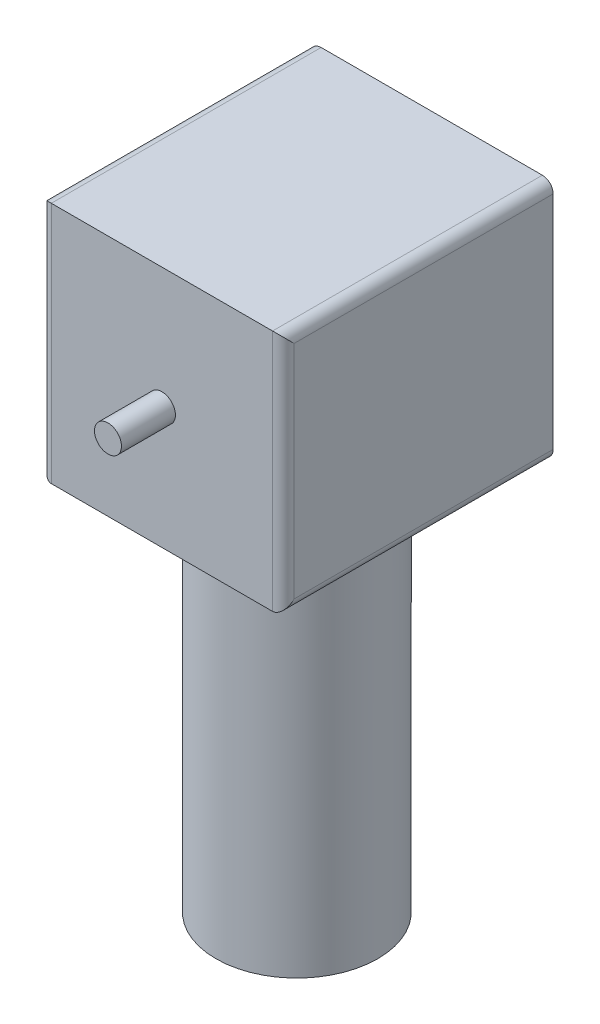
ISO-10303-21;
HEADER;
FILE_DESCRIPTION(('STEP AP214'),'2;1');
FILE_NAME('part.step','',(''),(''),'','','');
FILE_SCHEMA(('AUTOMOTIVE_DESIGN { 1 0 10303 214 1 1 1 1 }'));
ENDSEC;
DATA;
#1=APPLICATION_CONTEXT('core data for automotive mechanical design processes');
#2=APPLICATION_PROTOCOL_DEFINITION('international standard','automotive_design',2000,#1);
#3=PRODUCT_CONTEXT('',#1,'mechanical');
#4=PRODUCT('Part','Part','',(#3));
#5=PRODUCT_RELATED_PRODUCT_CATEGORY('part','',(#4));
#6=PRODUCT_DEFINITION_FORMATION('','',#4);
#7=PRODUCT_DEFINITION_CONTEXT('part definition',#1,'design');
#8=PRODUCT_DEFINITION('design','',#6,#7);
#9=PRODUCT_DEFINITION_SHAPE('','',#8);
#10=(LENGTH_UNIT() NAMED_UNIT(*) SI_UNIT(.MILLI.,.METRE.));
#11=(NAMED_UNIT(*) PLANE_ANGLE_UNIT() SI_UNIT($,.RADIAN.));
#12=(NAMED_UNIT(*) SI_UNIT($,.STERADIAN.) SOLID_ANGLE_UNIT());
#13=UNCERTAINTY_MEASURE_WITH_UNIT(LENGTH_MEASURE(1.E-05),#10,'distance_accuracy_value','');
#14=(GEOMETRIC_REPRESENTATION_CONTEXT(3) GLOBAL_UNCERTAINTY_ASSIGNED_CONTEXT((#13)) GLOBAL_UNIT_ASSIGNED_CONTEXT((#10,
#11,#12)) REPRESENTATION_CONTEXT('',''));
#15=CARTESIAN_POINT('',(0.,0.,0.));
#16=DIRECTION('',(0.,0.,1.));
#17=DIRECTION('',(1.,0.,0.));
#18=AXIS2_PLACEMENT_3D('',#15,#16,#17);
#19=CARTESIAN_POINT('',(22.5,22.5,50.));
#20=DIRECTION('',(-1.,0.,0.));
#21=DIRECTION('',(0.,-1.,0.));
#22=AXIS2_PLACEMENT_3D('',#19,#20,#21);
#23=PLANE('',#22);
#24=DIRECTION('',(0.,1.,0.));
#25=VECTOR('',#24,1.);
#26=CARTESIAN_POINT('',(22.5,-22.5,48.));
#27=LINE('',#26,#25);
#28=CARTESIAN_POINT('',(22.5,20.5,48.));
#29=VERTEX_POINT('',#28);
#30=CARTESIAN_POINT('',(22.5,-20.5,48.));
#31=VERTEX_POINT('',#30);
#32=EDGE_CURVE('E105',#29,#31,#27,.F.);
#33=ORIENTED_EDGE('',*,*,#32,.T.);
#34=DIRECTION('',(0.,0.,-1.));
#35=VECTOR('',#34,1.);
#36=CARTESIAN_POINT('',(22.5,-20.5,50.));
#37=LINE('',#36,#35);
#38=CARTESIAN_POINT('',(22.5,-20.5,0.));
#39=VERTEX_POINT('',#38);
#40=EDGE_CURVE('E158',#31,#39,#37,.T.);
#41=ORIENTED_EDGE('',*,*,#40,.T.);
#42=DIRECTION('',(0.,1.,0.));
#43=VECTOR('',#42,1.);
#44=CARTESIAN_POINT('',(22.5,22.5,0.));
#45=LINE('',#44,#43);
#46=CARTESIAN_POINT('',(22.5,20.5,0.));
#47=VERTEX_POINT('',#46);
#48=EDGE_CURVE('E141',#39,#47,#45,.T.);
#49=ORIENTED_EDGE('',*,*,#48,.T.);
#50=DIRECTION('',(0.,0.,-1.));
#51=VECTOR('',#50,1.);
#52=CARTESIAN_POINT('',(22.5,20.5,50.));
#53=LINE('',#52,#51);
#54=EDGE_CURVE('E155',#47,#29,#53,.F.);
#55=ORIENTED_EDGE('',*,*,#54,.T.);
#56=EDGE_LOOP('',(#33,#41,#49,#55));
#57=FACE_BOUND('',#56,.T.);
#58=ADVANCED_FACE('F32',(#57),#23,.F.);
#59=CARTESIAN_POINT('',(-22.5,22.5,50.));
#60=DIRECTION('',(0.,-1.,0.));
#61=DIRECTION('',(0.,0.,-1.));
#62=AXIS2_PLACEMENT_3D('',#59,#60,#61);
#63=PLANE('',#62);
#64=DIRECTION('',(-1.,0.,0.));
#65=VECTOR('',#64,1.);
#66=CARTESIAN_POINT('',(-22.5,22.5,0.));
#67=LINE('',#66,#65);
#68=CARTESIAN_POINT('',(20.5,22.5,0.));
#69=VERTEX_POINT('',#68);
#70=CARTESIAN_POINT('',(-20.5,22.5,0.));
#71=VERTEX_POINT('',#70);
#72=EDGE_CURVE('E144',#69,#71,#67,.T.);
#73=ORIENTED_EDGE('',*,*,#72,.T.);
#74=DIRECTION('',(0.,0.,-1.));
#75=VECTOR('',#74,1.);
#76=CARTESIAN_POINT('',(-20.5,22.5,50.));
#77=LINE('',#76,#75);
#78=CARTESIAN_POINT('',(-20.5,22.5,50.));
#79=VERTEX_POINT('',#78);
#80=EDGE_CURVE('E114',#71,#79,#77,.F.);
#81=ORIENTED_EDGE('',*,*,#80,.T.);
#82=DIRECTION('',(-1.,0.,0.));
#83=VECTOR('',#82,1.);
#84=CARTESIAN_POINT('',(-22.5,22.5,50.));
#85=LINE('',#84,#83);
#86=CARTESIAN_POINT('',(20.5,22.5,50.));
#87=VERTEX_POINT('',#86);
#88=EDGE_CURVE('E122',#87,#79,#85,.T.);
#89=ORIENTED_EDGE('',*,*,#88,.F.);
#90=DIRECTION('',(0.,0.,-1.));
#91=VECTOR('',#90,1.);
#92=CARTESIAN_POINT('',(20.5,22.5,50.));
#93=LINE('',#92,#91);
#94=EDGE_CURVE('E54',#87,#69,#93,.T.);
#95=ORIENTED_EDGE('',*,*,#94,.T.);
#96=EDGE_LOOP('',(#73,#81,#89,#95));
#97=FACE_BOUND('',#96,.T.);
#98=ADVANCED_FACE('F129',(#97),#63,.F.);
#99=CARTESIAN_POINT('',(-22.5,22.5,50.));
#100=DIRECTION('',(1.,0.,0.));
#101=DIRECTION('',(0.,1.,0.));
#102=AXIS2_PLACEMENT_3D('',#99,#100,#101);
#103=PLANE('',#102);
#104=DIRECTION('',(0.,-1.,0.));
#105=VECTOR('',#104,1.);
#106=CARTESIAN_POINT('',(-22.5,22.5,0.));
#107=LINE('',#106,#105);
#108=CARTESIAN_POINT('',(-22.5,20.5,0.));
#109=VERTEX_POINT('',#108);
#110=CARTESIAN_POINT('',(-22.5,-20.5,0.));
#111=VERTEX_POINT('',#110);
#112=EDGE_CURVE('E135',#109,#111,#107,.T.);
#113=ORIENTED_EDGE('',*,*,#112,.T.);
#114=DIRECTION('',(0.,0.,-1.));
#115=VECTOR('',#114,1.);
#116=CARTESIAN_POINT('',(-22.5,-20.5,50.));
#117=LINE('',#116,#115);
#118=CARTESIAN_POINT('',(-22.5,-20.5,48.));
#119=VERTEX_POINT('',#118);
#120=EDGE_CURVE('E153',#111,#119,#117,.F.);
#121=ORIENTED_EDGE('',*,*,#120,.T.);
#122=DIRECTION('',(0.,-1.,0.));
#123=VECTOR('',#122,1.);
#124=CARTESIAN_POINT('',(-22.5,22.5,48.));
#125=LINE('',#124,#123);
#126=CARTESIAN_POINT('',(-22.5,20.5,48.));
#127=VERTEX_POINT('',#126);
#128=EDGE_CURVE('E151',#119,#127,#125,.F.);
#129=ORIENTED_EDGE('',*,*,#128,.T.);
#130=DIRECTION('',(0.,0.,-1.));
#131=VECTOR('',#130,1.);
#132=CARTESIAN_POINT('',(-22.5,20.5,50.));
#133=LINE('',#132,#131);
#134=EDGE_CURVE('E149',#127,#109,#133,.T.);
#135=ORIENTED_EDGE('',*,*,#134,.T.);
#136=EDGE_LOOP('',(#113,#121,#129,#135));
#137=FACE_BOUND('',#136,.T.);
#138=ADVANCED_FACE('F214',(#137),#103,.F.);
#139=CARTESIAN_POINT('',(-22.5,-22.5,50.));
#140=DIRECTION('',(0.,1.,0.));
#141=DIRECTION('',(0.,0.,1.));
#142=AXIS2_PLACEMENT_3D('',#139,#140,#141);
#143=PLANE('',#142);
#144=CARTESIAN_POINT('',(0.,-22.5,25.));
#145=DIRECTION('',(0.,1.,0.));
#146=DIRECTION('',(0.,0.,1.));
#147=AXIS2_PLACEMENT_3D('',#144,#145,#146);
#148=CIRCLE('',#147,20.);
#149=CARTESIAN_POINT('',(0.,-22.5,45.));
#150=VERTEX_POINT('',#149);
#151=EDGE_CURVE('E40',#150,#150,#148,.T.);
#152=ORIENTED_EDGE('',*,*,#151,.T.);
#153=EDGE_LOOP('',(#152));
#154=FACE_BOUND('',#153,.T.);
#155=DIRECTION('',(1.,0.,0.));
#156=VECTOR('',#155,1.);
#157=CARTESIAN_POINT('',(-22.5,-22.5,0.));
#158=LINE('',#157,#156);
#159=CARTESIAN_POINT('',(-20.5,-22.5,0.));
#160=VERTEX_POINT('',#159);
#161=CARTESIAN_POINT('',(20.5,-22.5,0.));
#162=VERTEX_POINT('',#161);
#163=EDGE_CURVE('E131',#160,#162,#158,.T.);
#164=ORIENTED_EDGE('',*,*,#163,.T.);
#165=DIRECTION('',(0.,0.,-1.));
#166=VECTOR('',#165,1.);
#167=CARTESIAN_POINT('',(20.5,-22.5,50.));
#168=LINE('',#167,#166);
#169=CARTESIAN_POINT('',(20.5,-22.5,50.));
#170=VERTEX_POINT('',#169);
#171=EDGE_CURVE('E115',#162,#170,#168,.F.);
#172=ORIENTED_EDGE('',*,*,#171,.T.);
#173=DIRECTION('',(1.,0.,0.));
#174=VECTOR('',#173,1.);
#175=CARTESIAN_POINT('',(-22.5,-22.5,50.));
#176=LINE('',#175,#174);
#177=CARTESIAN_POINT('',(-20.5,-22.5,50.));
#178=VERTEX_POINT('',#177);
#179=EDGE_CURVE('E125',#178,#170,#176,.T.);
#180=ORIENTED_EDGE('',*,*,#179,.F.);
#181=DIRECTION('',(0.,0.,-1.));
#182=VECTOR('',#181,1.);
#183=CARTESIAN_POINT('',(-20.5,-22.5,50.));
#184=LINE('',#183,#182);
#185=EDGE_CURVE('E166',#178,#160,#184,.T.);
#186=ORIENTED_EDGE('',*,*,#185,.T.);
#187=EDGE_LOOP('',(#164,#172,#180,#186));
#188=FACE_BOUND('',#187,.T.);
#189=ADVANCED_FACE('F181',(#154,#188),#143,.F.);
#190=CARTESIAN_POINT('',(0.,0.,50.));
#191=DIRECTION('',(0.,0.,1.));
#192=DIRECTION('',(1.,0.,0.));
#193=AXIS2_PLACEMENT_3D('',#190,#191,#192);
#194=PLANE('',#193);
#195=CARTESIAN_POINT('',(0.,0.,50.));
#196=DIRECTION('',(0.,0.,1.));
#197=DIRECTION('',(1.,0.,0.));
#198=AXIS2_PLACEMENT_3D('',#195,#196,#197);
#199=CIRCLE('',#198,2.5);
#200=CARTESIAN_POINT('',(2.5,0.,50.));
#201=VERTEX_POINT('',#200);
#202=EDGE_CURVE('E263',#201,#201,#199,.T.);
#203=ORIENTED_EDGE('',*,*,#202,.F.);
#204=EDGE_LOOP('',(#203));
#205=FACE_BOUND('',#204,.T.);
#206=ORIENTED_EDGE('',*,*,#88,.T.);
#207=DIRECTION('',(0.,-1.,0.));
#208=VECTOR('',#207,1.);
#209=CARTESIAN_POINT('',(-20.5,-22.5,50.));
#210=LINE('',#209,#208);
#211=EDGE_CURVE('E127',#79,#178,#210,.T.);
#212=ORIENTED_EDGE('',*,*,#211,.T.);
#213=ORIENTED_EDGE('',*,*,#179,.T.);
#214=DIRECTION('',(0.,1.,0.));
#215=VECTOR('',#214,1.);
#216=CARTESIAN_POINT('',(20.5,22.5,50.));
#217=LINE('',#216,#215);
#218=EDGE_CURVE('E104',#170,#87,#217,.T.);
#219=ORIENTED_EDGE('',*,*,#218,.T.);
#220=EDGE_LOOP('',(#206,#212,#213,#219));
#221=FACE_BOUND('',#220,.T.);
#222=ADVANCED_FACE('F120',(#205,#221),#194,.T.);
#223=CARTESIAN_POINT('',(0.,0.,0.));
#224=DIRECTION('',(0.,0.,1.));
#225=DIRECTION('',(1.,0.,0.));
#226=AXIS2_PLACEMENT_3D('',#223,#224,#225);
#227=PLANE('',#226);
#228=CARTESIAN_POINT('',(0.,0.,0.));
#229=DIRECTION('',(0.,0.,1.));
#230=DIRECTION('',(1.,0.,0.));
#231=AXIS2_PLACEMENT_3D('',#228,#229,#230);
#232=CIRCLE('',#231,2.5);
#233=CARTESIAN_POINT('',(2.5,0.,0.));
#234=VERTEX_POINT('',#233);
#235=EDGE_CURVE('E11',#234,#234,#232,.F.);
#236=ORIENTED_EDGE('',*,*,#235,.F.);
#237=EDGE_LOOP('',(#236));
#238=FACE_BOUND('',#237,.T.);
#239=ORIENTED_EDGE('',*,*,#48,.F.);
#240=CARTESIAN_POINT('',(20.5,-20.5,0.));
#241=DIRECTION('',(0.,0.,1.));
#242=DIRECTION('',(1.,0.,0.));
#243=AXIS2_PLACEMENT_3D('',#240,#241,#242);
#244=CIRCLE('',#243,2.);
#245=EDGE_CURVE('E164',#39,#162,#244,.F.);
#246=ORIENTED_EDGE('',*,*,#245,.T.);
#247=ORIENTED_EDGE('',*,*,#163,.F.);
#248=CARTESIAN_POINT('',(-20.5,-20.5,0.));
#249=DIRECTION('',(0.,0.,1.));
#250=DIRECTION('',(1.,0.,0.));
#251=AXIS2_PLACEMENT_3D('',#248,#249,#250);
#252=CIRCLE('',#251,2.);
#253=EDGE_CURVE('E162',#160,#111,#252,.F.);
#254=ORIENTED_EDGE('',*,*,#253,.T.);
#255=ORIENTED_EDGE('',*,*,#112,.F.);
#256=CARTESIAN_POINT('',(-20.5,20.5,0.));
#257=DIRECTION('',(0.,0.,1.));
#258=DIRECTION('',(1.,0.,0.));
#259=AXIS2_PLACEMENT_3D('',#256,#257,#258);
#260=CIRCLE('',#259,2.);
#261=EDGE_CURVE('E47',#109,#71,#260,.F.);
#262=ORIENTED_EDGE('',*,*,#261,.T.);
#263=ORIENTED_EDGE('',*,*,#72,.F.);
#264=CARTESIAN_POINT('',(20.5,20.5,0.));
#265=DIRECTION('',(0.,0.,1.));
#266=DIRECTION('',(1.,0.,0.));
#267=AXIS2_PLACEMENT_3D('',#264,#265,#266);
#268=CIRCLE('',#267,2.);
#269=EDGE_CURVE('E113',#69,#47,#268,.F.);
#270=ORIENTED_EDGE('',*,*,#269,.T.);
#271=EDGE_LOOP('',(#239,#246,#247,#254,#255,#262,#263,#270));
#272=FACE_BOUND('',#271,.T.);
#273=ADVANCED_FACE('F193',(#238,#272),#227,.F.);
#274=CARTESIAN_POINT('',(0.,-93.5,25.));
#275=DIRECTION('',(0.,1.,0.));
#276=DIRECTION('',(0.,0.,1.));
#277=AXIS2_PLACEMENT_3D('',#274,#275,#276);
#278=CYLINDRICAL_SURFACE('',#277,15.);
#279=CARTESIAN_POINT('',(0.,-27.5,25.));
#280=DIRECTION('',(0.,1.,0.));
#281=DIRECTION('',(0.,0.,1.));
#282=AXIS2_PLACEMENT_3D('',#279,#280,#281);
#283=CIRCLE('',#282,15.);
#284=CARTESIAN_POINT('',(0.,-27.5,40.));
#285=VERTEX_POINT('',#284);
#286=EDGE_CURVE('E170',#285,#285,#283,.F.);
#287=ORIENTED_EDGE('',*,*,#286,.T.);
#288=EDGE_LOOP('',(#287));
#289=FACE_BOUND('',#288,.T.);
#290=CARTESIAN_POINT('',(0.,-93.5,25.));
#291=DIRECTION('',(0.,-1.,0.));
#292=DIRECTION('',(0.,0.,-1.));
#293=AXIS2_PLACEMENT_3D('',#290,#291,#292);
#294=CIRCLE('',#293,15.);
#295=CARTESIAN_POINT('',(0.,-93.5,10.));
#296=VERTEX_POINT('',#295);
#297=EDGE_CURVE('E138',#296,#296,#294,.T.);
#298=ORIENTED_EDGE('',*,*,#297,.F.);
#299=EDGE_LOOP('',(#298));
#300=FACE_BOUND('',#299,.T.);
#301=ADVANCED_FACE('F189',(#289,#300),#278,.T.);
#302=CARTESIAN_POINT('',(0.,-93.5,25.));
#303=DIRECTION('',(0.,-1.,0.));
#304=DIRECTION('',(0.,0.,-1.));
#305=AXIS2_PLACEMENT_3D('',#302,#303,#304);
#306=PLANE('',#305);
#307=ORIENTED_EDGE('',*,*,#297,.T.);
#308=EDGE_LOOP('',(#307));
#309=FACE_BOUND('',#308,.T.);
#310=ADVANCED_FACE('F192',(#309),#306,.T.);
#311=CARTESIAN_POINT('',(-20.5,20.5,50.));
#312=DIRECTION('',(0.,0.,-1.));
#313=DIRECTION('',(-1.,0.,0.));
#314=AXIS2_PLACEMENT_3D('',#311,#312,#313);
#315=CYLINDRICAL_SURFACE('',#314,2.);
#316=ORIENTED_EDGE('',*,*,#261,.F.);
#317=ORIENTED_EDGE('',*,*,#134,.F.);
#318=CARTESIAN_POINT('',(-20.5,20.5,48.));
#319=DIRECTION('',(0.,0.707106781186547,-0.707106781186547));
#320=DIRECTION('',(0.,-0.707106781186547,-0.707106781186547));
#321=AXIS2_PLACEMENT_3D('',#318,#319,#320);
#322=ELLIPSE('',#321,2.82842712474619,2.);
#323=EDGE_CURVE('E173',#79,#127,#322,.F.);
#324=ORIENTED_EDGE('',*,*,#323,.F.);
#325=ORIENTED_EDGE('',*,*,#80,.F.);
#326=EDGE_LOOP('',(#316,#317,#324,#325));
#327=FACE_BOUND('',#326,.T.);
#328=ADVANCED_FACE('F199',(#327),#315,.T.);
#329=CARTESIAN_POINT('',(-20.5,-20.5,50.));
#330=DIRECTION('',(0.,0.,-1.));
#331=DIRECTION('',(-1.,0.,0.));
#332=AXIS2_PLACEMENT_3D('',#329,#330,#331);
#333=CYLINDRICAL_SURFACE('',#332,2.);
#334=ORIENTED_EDGE('',*,*,#253,.F.);
#335=ORIENTED_EDGE('',*,*,#185,.F.);
#336=CARTESIAN_POINT('',(-20.5,-20.5,48.));
#337=DIRECTION('',(0.,-0.707106781186547,-0.707106781186547));
#338=DIRECTION('',(0.,0.707106781186547,-0.707106781186547));
#339=AXIS2_PLACEMENT_3D('',#336,#337,#338);
#340=ELLIPSE('',#339,2.82842712474619,2.);
#341=EDGE_CURVE('E171',#119,#178,#340,.F.);
#342=ORIENTED_EDGE('',*,*,#341,.F.);
#343=ORIENTED_EDGE('',*,*,#120,.F.);
#344=EDGE_LOOP('',(#334,#335,#342,#343));
#345=FACE_BOUND('',#344,.T.);
#346=ADVANCED_FACE('F204',(#345),#333,.T.);
#347=CARTESIAN_POINT('',(-20.5,0.,48.));
#348=DIRECTION('',(0.,1.,0.));
#349=DIRECTION('',(-1.,0.,0.));
#350=AXIS2_PLACEMENT_3D('',#347,#348,#349);
#351=CYLINDRICAL_SURFACE('',#350,2.);
#352=ORIENTED_EDGE('',*,*,#323,.T.);
#353=ORIENTED_EDGE('',*,*,#128,.F.);
#354=ORIENTED_EDGE('',*,*,#341,.T.);
#355=ORIENTED_EDGE('',*,*,#211,.F.);
#356=EDGE_LOOP('',(#352,#353,#354,#355));
#357=FACE_BOUND('',#356,.T.);
#358=ADVANCED_FACE('F218',(#357),#351,.T.);
#359=CARTESIAN_POINT('',(20.5,-20.5,50.));
#360=DIRECTION('',(0.,0.,-1.));
#361=DIRECTION('',(-1.,0.,0.));
#362=AXIS2_PLACEMENT_3D('',#359,#360,#361);
#363=CYLINDRICAL_SURFACE('',#362,2.);
#364=ORIENTED_EDGE('',*,*,#245,.F.);
#365=ORIENTED_EDGE('',*,*,#40,.F.);
#366=CARTESIAN_POINT('',(20.5,-20.5,48.));
#367=DIRECTION('',(0.,-0.707106781186547,-0.707106781186547));
#368=DIRECTION('',(0.,0.707106781186547,-0.707106781186547));
#369=AXIS2_PLACEMENT_3D('',#366,#367,#368);
#370=ELLIPSE('',#369,2.82842712474619,2.);
#371=EDGE_CURVE('E108',#170,#31,#370,.F.);
#372=ORIENTED_EDGE('',*,*,#371,.F.);
#373=ORIENTED_EDGE('',*,*,#171,.F.);
#374=EDGE_LOOP('',(#364,#365,#372,#373));
#375=FACE_BOUND('',#374,.T.);
#376=ADVANCED_FACE('F221',(#375),#363,.T.);
#377=CARTESIAN_POINT('',(20.5,20.5,50.));
#378=DIRECTION('',(0.,0.,-1.));
#379=DIRECTION('',(-1.,0.,0.));
#380=AXIS2_PLACEMENT_3D('',#377,#378,#379);
#381=CYLINDRICAL_SURFACE('',#380,2.);
#382=ORIENTED_EDGE('',*,*,#269,.F.);
#383=ORIENTED_EDGE('',*,*,#94,.F.);
#384=CARTESIAN_POINT('',(20.5,20.5,48.));
#385=DIRECTION('',(0.,0.707106781186547,-0.707106781186547));
#386=DIRECTION('',(0.,-0.707106781186547,-0.707106781186547));
#387=AXIS2_PLACEMENT_3D('',#384,#385,#386);
#388=ELLIPSE('',#387,2.82842712474619,2.);
#389=EDGE_CURVE('E100',#29,#87,#388,.F.);
#390=ORIENTED_EDGE('',*,*,#389,.F.);
#391=ORIENTED_EDGE('',*,*,#54,.F.);
#392=EDGE_LOOP('',(#382,#383,#390,#391));
#393=FACE_BOUND('',#392,.T.);
#394=ADVANCED_FACE('F112',(#393),#381,.T.);
#395=CARTESIAN_POINT('',(20.5,0.,48.));
#396=DIRECTION('',(0.,-1.,0.));
#397=DIRECTION('',(1.,0.,0.));
#398=AXIS2_PLACEMENT_3D('',#395,#396,#397);
#399=CYLINDRICAL_SURFACE('',#398,2.);
#400=ORIENTED_EDGE('',*,*,#371,.T.);
#401=ORIENTED_EDGE('',*,*,#32,.F.);
#402=ORIENTED_EDGE('',*,*,#389,.T.);
#403=ORIENTED_EDGE('',*,*,#218,.F.);
#404=EDGE_LOOP('',(#400,#401,#402,#403));
#405=FACE_BOUND('',#404,.T.);
#406=ADVANCED_FACE('F102',(#405),#399,.T.);
#407=CARTESIAN_POINT('',(0.,-27.5,25.));
#408=DIRECTION('',(0.,1.,0.));
#409=DIRECTION('',(0.,0.,1.));
#410=AXIS2_PLACEMENT_3D('',#407,#408,#409);
#411=TOROIDAL_SURFACE('',#410,20.,5.);
#412=ORIENTED_EDGE('',*,*,#151,.F.);
#413=EDGE_LOOP('',(#412));
#414=FACE_BOUND('',#413,.T.);
#415=ORIENTED_EDGE('',*,*,#286,.F.);
#416=EDGE_LOOP('',(#415));
#417=FACE_BOUND('',#416,.T.);
#418=ADVANCED_FACE('F34',(#414,#417),#411,.F.);
#419=CARTESIAN_POINT('',(0.,0.,60.));
#420=DIRECTION('',(0.,0.,-1.));
#421=DIRECTION('',(-1.,0.,0.));
#422=AXIS2_PLACEMENT_3D('',#419,#420,#421);
#423=CYLINDRICAL_SURFACE('',#422,2.5);
#424=CARTESIAN_POINT('',(0.,0.,60.));
#425=DIRECTION('',(0.,0.,1.));
#426=DIRECTION('',(1.,0.,0.));
#427=AXIS2_PLACEMENT_3D('',#424,#425,#426);
#428=CIRCLE('',#427,2.5);
#429=CARTESIAN_POINT('',(2.5,0.,60.));
#430=VERTEX_POINT('',#429);
#431=EDGE_CURVE('E109',#430,#430,#428,.T.);
#432=ORIENTED_EDGE('',*,*,#431,.F.);
#433=EDGE_LOOP('',(#432));
#434=FACE_BOUND('',#433,.T.);
#435=ORIENTED_EDGE('',*,*,#202,.T.);
#436=EDGE_LOOP('',(#435));
#437=FACE_BOUND('',#436,.T.);
#438=ADVANCED_FACE('F186',(#434,#437),#423,.T.);
#439=CARTESIAN_POINT('',(0.,0.,60.));
#440=DIRECTION('',(0.,0.,1.));
#441=DIRECTION('',(1.,0.,0.));
#442=AXIS2_PLACEMENT_3D('',#439,#440,#441);
#443=PLANE('',#442);
#444=ORIENTED_EDGE('',*,*,#431,.T.);
#445=EDGE_LOOP('',(#444));
#446=FACE_BOUND('',#445,.T.);
#447=ADVANCED_FACE('F277',(#446),#443,.T.);
#448=CARTESIAN_POINT('',(0.,0.,-10.));
#449=DIRECTION('',(0.,0.,1.));
#450=DIRECTION('',(1.,0.,0.));
#451=AXIS2_PLACEMENT_3D('',#448,#449,#450);
#452=CYLINDRICAL_SURFACE('',#451,2.5);
#453=CARTESIAN_POINT('',(0.,0.,-10.));
#454=DIRECTION('',(0.,0.,-1.));
#455=DIRECTION('',(-1.,0.,0.));
#456=AXIS2_PLACEMENT_3D('',#453,#454,#455);
#457=CIRCLE('',#456,2.5);
#458=CARTESIAN_POINT('',(-2.5,0.,-10.));
#459=VERTEX_POINT('',#458);
#460=EDGE_CURVE('E265',#459,#459,#457,.T.);
#461=ORIENTED_EDGE('',*,*,#460,.F.);
#462=EDGE_LOOP('',(#461));
#463=FACE_BOUND('',#462,.T.);
#464=ORIENTED_EDGE('',*,*,#235,.T.);
#465=EDGE_LOOP('',(#464));
#466=FACE_BOUND('',#465,.T.);
#467=ADVANCED_FACE('F274',(#463,#466),#452,.T.);
#468=CARTESIAN_POINT('',(0.,0.,-10.));
#469=DIRECTION('',(0.,0.,-1.));
#470=DIRECTION('',(-1.,0.,0.));
#471=AXIS2_PLACEMENT_3D('',#468,#469,#470);
#472=PLANE('',#471);
#473=ORIENTED_EDGE('',*,*,#460,.T.);
#474=EDGE_LOOP('',(#473));
#475=FACE_BOUND('',#474,.T.);
#476=ADVANCED_FACE('F272',(#475),#472,.T.);
#477=CLOSED_SHELL('',(#58,#98,#138,#189,#222,#273,#301,#310,#328,#346,#358,#376,#394,#406,#418,
#438,#447,#467,#476));
#478=MANIFOLD_SOLID_BREP('B2',#477);
#479=ADVANCED_BREP_SHAPE_REPRESENTATION('',(#18,#478),#14);
#480=SHAPE_DEFINITION_REPRESENTATION(#9,#479);
ENDSEC;
END-ISO-10303-21;
